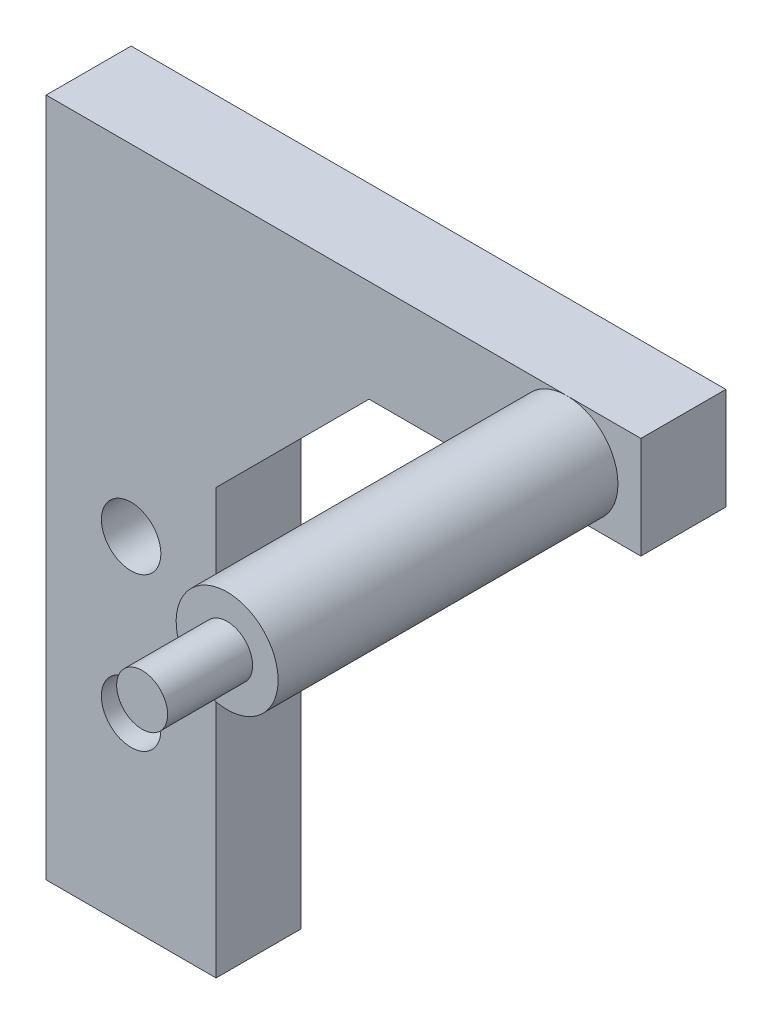
ISO-10303-21;
HEADER;
FILE_DESCRIPTION(('STEP AP214'),'2;1');
FILE_NAME('part.step','',(''),(''),'','','');
FILE_SCHEMA(('AUTOMOTIVE_DESIGN { 1 0 10303 214 1 1 1 1 }'));
ENDSEC;
DATA;
#1=APPLICATION_CONTEXT('core data for automotive mechanical design processes');
#2=APPLICATION_PROTOCOL_DEFINITION('international standard','automotive_design',2000,#1);
#3=PRODUCT_CONTEXT('',#1,'mechanical');
#4=PRODUCT('Part','Part','',(#3));
#5=PRODUCT_RELATED_PRODUCT_CATEGORY('part','',(#4));
#6=PRODUCT_DEFINITION_FORMATION('','',#4);
#7=PRODUCT_DEFINITION_CONTEXT('part definition',#1,'design');
#8=PRODUCT_DEFINITION('design','',#6,#7);
#9=PRODUCT_DEFINITION_SHAPE('','',#8);
#10=(LENGTH_UNIT() NAMED_UNIT(*) SI_UNIT(.MILLI.,.METRE.));
#11=(NAMED_UNIT(*) PLANE_ANGLE_UNIT() SI_UNIT($,.RADIAN.));
#12=(NAMED_UNIT(*) SI_UNIT($,.STERADIAN.) SOLID_ANGLE_UNIT());
#13=UNCERTAINTY_MEASURE_WITH_UNIT(LENGTH_MEASURE(1.E-05),#10,'distance_accuracy_value','');
#14=(GEOMETRIC_REPRESENTATION_CONTEXT(3) GLOBAL_UNCERTAINTY_ASSIGNED_CONTEXT((#13)) GLOBAL_UNIT_ASSIGNED_CONTEXT((#10,
#11,#12)) REPRESENTATION_CONTEXT('',''));
#15=CARTESIAN_POINT('',(0.,0.,0.));
#16=DIRECTION('',(0.,0.,1.));
#17=DIRECTION('',(1.,0.,0.));
#18=AXIS2_PLACEMENT_3D('',#15,#16,#17);
#19=CARTESIAN_POINT('',(0.,0.,5.));
#20=DIRECTION('',(0.,0.,-1.));
#21=DIRECTION('',(-1.,0.,0.));
#22=AXIS2_PLACEMENT_3D('',#19,#20,#21);
#23=PLANE('',#22);
#24=CARTESIAN_POINT('',(25.65,17.,5.));
#25=DIRECTION('',(0.,0.,1.));
#26=DIRECTION('',(1.,0.,0.));
#27=AXIS2_PLACEMENT_3D('',#24,#25,#26);
#28=CIRCLE('',#27,3.);
#29=CARTESIAN_POINT('',(25.65,20.,5.));
#30=VERTEX_POINT('',#29);
#31=CARTESIAN_POINT('',(25.65,14.,5.));
#32=VERTEX_POINT('',#31);
#33=EDGE_CURVE('E175',#30,#32,#28,.T.);
#34=ORIENTED_EDGE('',*,*,#33,.F.);
#35=DIRECTION('',(-1.,0.,0.));
#36=VECTOR('',#35,1.);
#37=CARTESIAN_POINT('',(-5.,20.,5.));
#38=LINE('',#37,#36);
#39=CARTESIAN_POINT('',(-5.,20.,5.));
#40=VERTEX_POINT('',#39);
#41=EDGE_CURVE('E247',#30,#40,#38,.T.);
#42=ORIENTED_EDGE('',*,*,#41,.T.);
#43=DIRECTION('',(0.,-1.,0.));
#44=VECTOR('',#43,1.);
#45=CARTESIAN_POINT('',(-5.,-20.,5.));
#46=LINE('',#45,#44);
#47=CARTESIAN_POINT('',(-5.,-20.,5.));
#48=VERTEX_POINT('',#47);
#49=EDGE_CURVE('E249',#40,#48,#46,.T.);
#50=ORIENTED_EDGE('',*,*,#49,.T.);
#51=DIRECTION('',(1.,0.,0.));
#52=VECTOR('',#51,1.);
#53=CARTESIAN_POINT('',(-5.,-20.,5.));
#54=LINE('',#53,#52);
#55=CARTESIAN_POINT('',(5.,-20.,5.));
#56=VERTEX_POINT('',#55);
#57=EDGE_CURVE('E156',#48,#56,#54,.T.);
#58=ORIENTED_EDGE('',*,*,#57,.T.);
#59=DIRECTION('',(0.,1.,0.));
#60=VECTOR('',#59,1.);
#61=CARTESIAN_POINT('',(5.,-20.,5.));
#62=LINE('',#61,#60);
#63=CARTESIAN_POINT('',(5.,5.,5.));
#64=VERTEX_POINT('',#63);
#65=EDGE_CURVE('E162',#56,#64,#62,.T.);
#66=ORIENTED_EDGE('',*,*,#65,.T.);
#67=DIRECTION('',(0.707106781186549,0.707106781186546,0.));
#68=VECTOR('',#67,1.);
#69=CARTESIAN_POINT('',(0.,0.,5.));
#70=LINE('',#69,#68);
#71=CARTESIAN_POINT('',(14.,14.,5.));
#72=VERTEX_POINT('',#71);
#73=EDGE_CURVE('E52',#64,#72,#70,.T.);
#74=ORIENTED_EDGE('',*,*,#73,.T.);
#75=DIRECTION('',(1.,0.,0.));
#76=VECTOR('',#75,1.);
#77=CARTESIAN_POINT('',(5.,14.,5.));
#78=LINE('',#77,#76);
#79=EDGE_CURVE('E57',#72,#32,#78,.T.);
#80=ORIENTED_EDGE('',*,*,#79,.T.);
#81=EDGE_LOOP('',(#34,#42,#50,#58,#66,#74,#80));
#82=FACE_BOUND('',#81,.T.);
#83=CARTESIAN_POINT('',(0.,0.,5.));
#84=DIRECTION('',(0.,0.,1.));
#85=DIRECTION('',(1.,0.,0.));
#86=AXIS2_PLACEMENT_3D('',#83,#84,#85);
#87=CIRCLE('',#86,1.75);
#88=CARTESIAN_POINT('',(1.75,0.,5.));
#89=VERTEX_POINT('',#88);
#90=EDGE_CURVE('E153',#89,#89,#87,.T.);
#91=ORIENTED_EDGE('',*,*,#90,.F.);
#92=EDGE_LOOP('',(#91));
#93=FACE_BOUND('',#92,.T.);
#94=CARTESIAN_POINT('',(0.,-9.,5.));
#95=DIRECTION('',(0.,0.,1.));
#96=DIRECTION('',(1.,0.,0.));
#97=AXIS2_PLACEMENT_3D('',#94,#95,#96);
#98=CIRCLE('',#97,1.75);
#99=CARTESIAN_POINT('',(1.75,-9.,5.));
#100=VERTEX_POINT('',#99);
#101=EDGE_CURVE('E232',#100,#100,#98,.T.);
#102=ORIENTED_EDGE('',*,*,#101,.F.);
#103=EDGE_LOOP('',(#102));
#104=FACE_BOUND('',#103,.T.);
#105=ADVANCED_FACE('F35',(#82,#93,#104),#23,.F.);
#106=CARTESIAN_POINT('',(5.,-20.,5.));
#107=DIRECTION('',(-1.,0.,0.));
#108=DIRECTION('',(0.,0.,1.));
#109=AXIS2_PLACEMENT_3D('',#106,#107,#108);
#110=PLANE('',#109);
#111=DIRECTION('',(0.,1.,0.));
#112=VECTOR('',#111,1.);
#113=CARTESIAN_POINT('',(5.,-20.,0.));
#114=LINE('',#113,#112);
#115=CARTESIAN_POINT('',(5.,-20.,0.));
#116=VERTEX_POINT('',#115);
#117=CARTESIAN_POINT('',(5.,5.,0.));
#118=VERTEX_POINT('',#117);
#119=EDGE_CURVE('E140',#116,#118,#114,.T.);
#120=ORIENTED_EDGE('',*,*,#119,.T.);
#121=DIRECTION('',(0.,0.,1.));
#122=VECTOR('',#121,1.);
#123=CARTESIAN_POINT('',(5.,5.,0.));
#124=LINE('',#123,#122);
#125=EDGE_CURVE('E125',#118,#64,#124,.T.);
#126=ORIENTED_EDGE('',*,*,#125,.T.);
#127=ORIENTED_EDGE('',*,*,#65,.F.);
#128=DIRECTION('',(0.,0.,-1.));
#129=VECTOR('',#128,1.);
#130=CARTESIAN_POINT('',(5.,-20.,5.));
#131=LINE('',#130,#129);
#132=EDGE_CURVE('E146',#56,#116,#131,.T.);
#133=ORIENTED_EDGE('',*,*,#132,.T.);
#134=EDGE_LOOP('',(#120,#126,#127,#133));
#135=FACE_BOUND('',#134,.T.);
#136=ADVANCED_FACE('F37',(#135),#110,.F.);
#137=CARTESIAN_POINT('',(-5.,20.,5.));
#138=DIRECTION('',(0.,-1.,0.));
#139=DIRECTION('',(0.,0.,-1.));
#140=AXIS2_PLACEMENT_3D('',#137,#138,#139);
#141=PLANE('',#140);
#142=DIRECTION('',(-1.,0.,0.));
#143=VECTOR('',#142,1.);
#144=CARTESIAN_POINT('',(-5.,20.,0.));
#145=LINE('',#144,#143);
#146=CARTESIAN_POINT('',(30.,20.,0.));
#147=VERTEX_POINT('',#146);
#148=CARTESIAN_POINT('',(-5.,20.,0.));
#149=VERTEX_POINT('',#148);
#150=EDGE_CURVE('E147',#147,#149,#145,.T.);
#151=ORIENTED_EDGE('',*,*,#150,.T.);
#152=DIRECTION('',(0.,0.,-1.));
#153=VECTOR('',#152,1.);
#154=CARTESIAN_POINT('',(-5.,20.,5.));
#155=LINE('',#154,#153);
#156=EDGE_CURVE('E39',#40,#149,#155,.T.);
#157=ORIENTED_EDGE('',*,*,#156,.F.);
#158=ORIENTED_EDGE('',*,*,#41,.F.);
#159=CARTESIAN_POINT('',(30.,20.,5.));
#160=VERTEX_POINT('',#159);
#161=EDGE_CURVE('E248',#160,#30,#38,.T.);
#162=ORIENTED_EDGE('',*,*,#161,.F.);
#163=DIRECTION('',(0.,0.,1.));
#164=VECTOR('',#163,1.);
#165=CARTESIAN_POINT('',(30.,20.,0.));
#166=LINE('',#165,#164);
#167=EDGE_CURVE('E201',#147,#160,#166,.T.);
#168=ORIENTED_EDGE('',*,*,#167,.F.);
#169=EDGE_LOOP('',(#151,#157,#158,#162,#168));
#170=FACE_BOUND('',#169,.T.);
#171=ADVANCED_FACE('F255',(#170),#141,.F.);
#172=CARTESIAN_POINT('',(-5.,-20.,5.));
#173=DIRECTION('',(1.,0.,0.));
#174=DIRECTION('',(0.,0.,-1.));
#175=AXIS2_PLACEMENT_3D('',#172,#173,#174);
#176=PLANE('',#175);
#177=DIRECTION('',(0.,-1.,0.));
#178=VECTOR('',#177,1.);
#179=CARTESIAN_POINT('',(-5.,-20.,0.));
#180=LINE('',#179,#178);
#181=CARTESIAN_POINT('',(-5.,-20.,0.));
#182=VERTEX_POINT('',#181);
#183=EDGE_CURVE('E150',#149,#182,#180,.T.);
#184=ORIENTED_EDGE('',*,*,#183,.T.);
#185=DIRECTION('',(0.,0.,-1.));
#186=VECTOR('',#185,1.);
#187=CARTESIAN_POINT('',(-5.,-20.,5.));
#188=LINE('',#187,#186);
#189=EDGE_CURVE('E163',#48,#182,#188,.T.);
#190=ORIENTED_EDGE('',*,*,#189,.F.);
#191=ORIENTED_EDGE('',*,*,#49,.F.);
#192=ORIENTED_EDGE('',*,*,#156,.T.);
#193=EDGE_LOOP('',(#184,#190,#191,#192));
#194=FACE_BOUND('',#193,.T.);
#195=ADVANCED_FACE('F253',(#194),#176,.F.);
#196=CARTESIAN_POINT('',(-5.,-20.,5.));
#197=DIRECTION('',(0.,1.,0.));
#198=DIRECTION('',(0.,0.,1.));
#199=AXIS2_PLACEMENT_3D('',#196,#197,#198);
#200=PLANE('',#199);
#201=DIRECTION('',(1.,0.,0.));
#202=VECTOR('',#201,1.);
#203=CARTESIAN_POINT('',(-5.,-20.,0.));
#204=LINE('',#203,#202);
#205=EDGE_CURVE('E160',#182,#116,#204,.T.);
#206=ORIENTED_EDGE('',*,*,#205,.T.);
#207=ORIENTED_EDGE('',*,*,#132,.F.);
#208=ORIENTED_EDGE('',*,*,#57,.F.);
#209=ORIENTED_EDGE('',*,*,#189,.T.);
#210=EDGE_LOOP('',(#206,#207,#208,#209));
#211=FACE_BOUND('',#210,.T.);
#212=ADVANCED_FACE('F251',(#211),#200,.F.);
#213=EDGE_CURVE('E44',#32,#30,#28,.T.);
#214=ORIENTED_EDGE('',*,*,#213,.F.);
#215=CARTESIAN_POINT('',(30.,14.,5.));
#216=VERTEX_POINT('',#215);
#217=EDGE_CURVE('E183',#32,#216,#78,.T.);
#218=ORIENTED_EDGE('',*,*,#217,.T.);
#219=DIRECTION('',(0.,1.,0.));
#220=VECTOR('',#219,1.);
#221=CARTESIAN_POINT('',(30.,20.,5.));
#222=LINE('',#221,#220);
#223=EDGE_CURVE('E194',#216,#160,#222,.T.);
#224=ORIENTED_EDGE('',*,*,#223,.T.);
#225=ORIENTED_EDGE('',*,*,#161,.T.);
#226=EDGE_LOOP('',(#214,#218,#224,#225));
#227=FACE_BOUND('',#226,.T.);
#228=ADVANCED_FACE('F261',(#227),#23,.F.);
#229=CARTESIAN_POINT('',(0.,0.,0.));
#230=DIRECTION('',(0.,0.,-1.));
#231=DIRECTION('',(-1.,0.,0.));
#232=AXIS2_PLACEMENT_3D('',#229,#230,#231);
#233=PLANE('',#232);
#234=DIRECTION('',(0.,-1.,0.));
#235=VECTOR('',#234,1.);
#236=CARTESIAN_POINT('',(2.5,17.5,0.));
#237=LINE('',#236,#235);
#238=CARTESIAN_POINT('',(2.5,17.5,0.));
#239=VERTEX_POINT('',#238);
#240=CARTESIAN_POINT('',(2.5,12.5,0.));
#241=VERTEX_POINT('',#240);
#242=EDGE_CURVE('E204',#239,#241,#237,.T.);
#243=ORIENTED_EDGE('',*,*,#242,.F.);
#244=DIRECTION('',(1.,0.,0.));
#245=VECTOR('',#244,1.);
#246=CARTESIAN_POINT('',(2.5,17.5,0.));
#247=LINE('',#246,#245);
#248=CARTESIAN_POINT('',(-2.5,17.5,0.));
#249=VERTEX_POINT('',#248);
#250=EDGE_CURVE('E211',#249,#239,#247,.T.);
#251=ORIENTED_EDGE('',*,*,#250,.F.);
#252=DIRECTION('',(0.,1.,0.));
#253=VECTOR('',#252,1.);
#254=CARTESIAN_POINT('',(-2.5,17.5,0.));
#255=LINE('',#254,#253);
#256=CARTESIAN_POINT('',(-2.5,12.5,0.));
#257=VERTEX_POINT('',#256);
#258=EDGE_CURVE('E225',#257,#249,#255,.T.);
#259=ORIENTED_EDGE('',*,*,#258,.F.);
#260=DIRECTION('',(-1.,0.,0.));
#261=VECTOR('',#260,1.);
#262=CARTESIAN_POINT('',(2.5,12.5,0.));
#263=LINE('',#262,#261);
#264=EDGE_CURVE('E222',#241,#257,#263,.T.);
#265=ORIENTED_EDGE('',*,*,#264,.F.);
#266=EDGE_LOOP('',(#243,#251,#259,#265));
#267=FACE_BOUND('',#266,.T.);
#268=CARTESIAN_POINT('',(0.,0.,0.));
#269=DIRECTION('',(0.,0.,1.));
#270=DIRECTION('',(1.,0.,0.));
#271=AXIS2_PLACEMENT_3D('',#268,#269,#270);
#272=CIRCLE('',#271,1.75);
#273=CARTESIAN_POINT('',(1.75,0.,0.));
#274=VERTEX_POINT('',#273);
#275=EDGE_CURVE('E148',#274,#274,#272,.T.);
#276=ORIENTED_EDGE('',*,*,#275,.T.);
#277=EDGE_LOOP('',(#276));
#278=FACE_BOUND('',#277,.T.);
#279=CARTESIAN_POINT('',(0.,-9.,0.));
#280=DIRECTION('',(0.,0.,1.));
#281=DIRECTION('',(1.,0.,0.));
#282=AXIS2_PLACEMENT_3D('',#279,#280,#281);
#283=CIRCLE('',#282,1.75);
#284=CARTESIAN_POINT('',(1.75,-9.,0.));
#285=VERTEX_POINT('',#284);
#286=EDGE_CURVE('E241',#285,#285,#283,.T.);
#287=ORIENTED_EDGE('',*,*,#286,.T.);
#288=EDGE_LOOP('',(#287));
#289=FACE_BOUND('',#288,.T.);
#290=ORIENTED_EDGE('',*,*,#119,.F.);
#291=ORIENTED_EDGE('',*,*,#205,.F.);
#292=ORIENTED_EDGE('',*,*,#183,.F.);
#293=ORIENTED_EDGE('',*,*,#150,.F.);
#294=DIRECTION('',(0.,1.,0.));
#295=VECTOR('',#294,1.);
#296=CARTESIAN_POINT('',(30.,20.,0.));
#297=LINE('',#296,#295);
#298=CARTESIAN_POINT('',(30.,14.,0.));
#299=VERTEX_POINT('',#298);
#300=EDGE_CURVE('E199',#299,#147,#297,.T.);
#301=ORIENTED_EDGE('',*,*,#300,.F.);
#302=DIRECTION('',(1.,0.,0.));
#303=VECTOR('',#302,1.);
#304=CARTESIAN_POINT('',(5.,14.,0.));
#305=LINE('',#304,#303);
#306=CARTESIAN_POINT('',(14.,14.,0.));
#307=VERTEX_POINT('',#306);
#308=EDGE_CURVE('E142',#307,#299,#305,.T.);
#309=ORIENTED_EDGE('',*,*,#308,.F.);
#310=DIRECTION('',(0.707106781186549,0.707106781186546,0.));
#311=VECTOR('',#310,1.);
#312=CARTESIAN_POINT('',(0.,0.,0.));
#313=LINE('',#312,#311);
#314=EDGE_CURVE('E128',#118,#307,#313,.T.);
#315=ORIENTED_EDGE('',*,*,#314,.F.);
#316=EDGE_LOOP('',(#290,#291,#292,#293,#301,#309,#315));
#317=FACE_BOUND('',#316,.T.);
#318=ADVANCED_FACE('F138',(#267,#278,#289,#317),#233,.T.);
#319=CARTESIAN_POINT('',(0.,-9.,0.));
#320=DIRECTION('',(0.,0.,1.));
#321=DIRECTION('',(1.,0.,0.));
#322=AXIS2_PLACEMENT_3D('',#319,#320,#321);
#323=CYLINDRICAL_SURFACE('',#322,1.75);
#324=ORIENTED_EDGE('',*,*,#286,.F.);
#325=EDGE_LOOP('',(#324));
#326=FACE_BOUND('',#325,.T.);
#327=ORIENTED_EDGE('',*,*,#101,.T.);
#328=EDGE_LOOP('',(#327));
#329=FACE_BOUND('',#328,.T.);
#330=ADVANCED_FACE('F276',(#326,#329),#323,.F.);
#331=CARTESIAN_POINT('',(0.,0.,0.));
#332=DIRECTION('',(0.,0.,1.));
#333=DIRECTION('',(1.,0.,0.));
#334=AXIS2_PLACEMENT_3D('',#331,#332,#333);
#335=CYLINDRICAL_SURFACE('',#334,1.75);
#336=ORIENTED_EDGE('',*,*,#275,.F.);
#337=EDGE_LOOP('',(#336));
#338=FACE_BOUND('',#337,.T.);
#339=ORIENTED_EDGE('',*,*,#90,.T.);
#340=EDGE_LOOP('',(#339));
#341=FACE_BOUND('',#340,.T.);
#342=ADVANCED_FACE('F313',(#338,#341),#335,.F.);
#343=CARTESIAN_POINT('',(2.5,17.5,2.));
#344=DIRECTION('',(1.,0.,0.));
#345=DIRECTION('',(0.,1.,0.));
#346=AXIS2_PLACEMENT_3D('',#343,#344,#345);
#347=PLANE('',#346);
#348=ORIENTED_EDGE('',*,*,#242,.T.);
#349=DIRECTION('',(0.,0.,-1.));
#350=VECTOR('',#349,1.);
#351=CARTESIAN_POINT('',(2.5,12.5,2.));
#352=LINE('',#351,#350);
#353=CARTESIAN_POINT('',(2.5,12.5,2.));
#354=VERTEX_POINT('',#353);
#355=EDGE_CURVE('E220',#354,#241,#352,.T.);
#356=ORIENTED_EDGE('',*,*,#355,.F.);
#357=DIRECTION('',(0.,-1.,0.));
#358=VECTOR('',#357,1.);
#359=CARTESIAN_POINT('',(2.5,17.5,2.));
#360=LINE('',#359,#358);
#361=CARTESIAN_POINT('',(2.5,17.5,2.));
#362=VERTEX_POINT('',#361);
#363=EDGE_CURVE('E207',#362,#354,#360,.T.);
#364=ORIENTED_EDGE('',*,*,#363,.F.);
#365=DIRECTION('',(0.,0.,-1.));
#366=VECTOR('',#365,1.);
#367=CARTESIAN_POINT('',(2.5,17.5,2.));
#368=LINE('',#367,#366);
#369=EDGE_CURVE('E230',#362,#239,#368,.T.);
#370=ORIENTED_EDGE('',*,*,#369,.T.);
#371=EDGE_LOOP('',(#348,#356,#364,#370));
#372=FACE_BOUND('',#371,.T.);
#373=ADVANCED_FACE('F303',(#372),#347,.F.);
#374=CARTESIAN_POINT('',(2.5,17.5,2.));
#375=DIRECTION('',(0.,1.,0.));
#376=DIRECTION('',(0.,0.,1.));
#377=AXIS2_PLACEMENT_3D('',#374,#375,#376);
#378=PLANE('',#377);
#379=ORIENTED_EDGE('',*,*,#250,.T.);
#380=ORIENTED_EDGE('',*,*,#369,.F.);
#381=DIRECTION('',(1.,0.,0.));
#382=VECTOR('',#381,1.);
#383=CARTESIAN_POINT('',(2.5,17.5,2.));
#384=LINE('',#383,#382);
#385=CARTESIAN_POINT('',(-2.5,17.5,2.));
#386=VERTEX_POINT('',#385);
#387=EDGE_CURVE('E217',#386,#362,#384,.T.);
#388=ORIENTED_EDGE('',*,*,#387,.F.);
#389=DIRECTION('',(0.,0.,-1.));
#390=VECTOR('',#389,1.);
#391=CARTESIAN_POINT('',(-2.5,17.5,2.));
#392=LINE('',#391,#390);
#393=EDGE_CURVE('E233',#386,#249,#392,.T.);
#394=ORIENTED_EDGE('',*,*,#393,.T.);
#395=EDGE_LOOP('',(#379,#380,#388,#394));
#396=FACE_BOUND('',#395,.T.);
#397=ADVANCED_FACE('F299',(#396),#378,.F.);
#398=CARTESIAN_POINT('',(-2.5,17.5,2.));
#399=DIRECTION('',(-1.,0.,0.));
#400=DIRECTION('',(0.,-1.,0.));
#401=AXIS2_PLACEMENT_3D('',#398,#399,#400);
#402=PLANE('',#401);
#403=ORIENTED_EDGE('',*,*,#258,.T.);
#404=ORIENTED_EDGE('',*,*,#393,.F.);
#405=DIRECTION('',(0.,1.,0.));
#406=VECTOR('',#405,1.);
#407=CARTESIAN_POINT('',(-2.5,17.5,2.));
#408=LINE('',#407,#406);
#409=CARTESIAN_POINT('',(-2.5,12.5,2.));
#410=VERTEX_POINT('',#409);
#411=EDGE_CURVE('E214',#410,#386,#408,.T.);
#412=ORIENTED_EDGE('',*,*,#411,.F.);
#413=DIRECTION('',(0.,0.,-1.));
#414=VECTOR('',#413,1.);
#415=CARTESIAN_POINT('',(-2.5,12.5,2.));
#416=LINE('',#415,#414);
#417=EDGE_CURVE('E235',#410,#257,#416,.T.);
#418=ORIENTED_EDGE('',*,*,#417,.T.);
#419=EDGE_LOOP('',(#403,#404,#412,#418));
#420=FACE_BOUND('',#419,.T.);
#421=ADVANCED_FACE('F302',(#420),#402,.F.);
#422=CARTESIAN_POINT('',(2.5,12.5,2.));
#423=DIRECTION('',(0.,-1.,0.));
#424=DIRECTION('',(0.,0.,-1.));
#425=AXIS2_PLACEMENT_3D('',#422,#423,#424);
#426=PLANE('',#425);
#427=ORIENTED_EDGE('',*,*,#264,.T.);
#428=ORIENTED_EDGE('',*,*,#417,.F.);
#429=DIRECTION('',(-1.,0.,0.));
#430=VECTOR('',#429,1.);
#431=CARTESIAN_POINT('',(2.5,12.5,2.));
#432=LINE('',#431,#430);
#433=EDGE_CURVE('E210',#354,#410,#432,.T.);
#434=ORIENTED_EDGE('',*,*,#433,.F.);
#435=ORIENTED_EDGE('',*,*,#355,.T.);
#436=EDGE_LOOP('',(#427,#428,#434,#435));
#437=FACE_BOUND('',#436,.T.);
#438=ADVANCED_FACE('F293',(#437),#426,.F.);
#439=CARTESIAN_POINT('',(0.,0.,2.));
#440=DIRECTION('',(0.,0.,-1.));
#441=DIRECTION('',(-1.,0.,0.));
#442=AXIS2_PLACEMENT_3D('',#439,#440,#441);
#443=PLANE('',#442);
#444=ORIENTED_EDGE('',*,*,#363,.T.);
#445=ORIENTED_EDGE('',*,*,#433,.T.);
#446=ORIENTED_EDGE('',*,*,#411,.T.);
#447=ORIENTED_EDGE('',*,*,#387,.T.);
#448=EDGE_LOOP('',(#444,#445,#446,#447));
#449=FACE_BOUND('',#448,.T.);
#450=ADVANCED_FACE('F285',(#449),#443,.T.);
#451=CARTESIAN_POINT('',(30.,20.,0.));
#452=DIRECTION('',(1.,0.,0.));
#453=DIRECTION('',(0.,0.,-1.));
#454=AXIS2_PLACEMENT_3D('',#451,#452,#453);
#455=PLANE('',#454);
#456=ORIENTED_EDGE('',*,*,#223,.F.);
#457=DIRECTION('',(0.,0.,1.));
#458=VECTOR('',#457,1.);
#459=CARTESIAN_POINT('',(30.,14.,0.));
#460=LINE('',#459,#458);
#461=EDGE_CURVE('E205',#299,#216,#460,.T.);
#462=ORIENTED_EDGE('',*,*,#461,.F.);
#463=ORIENTED_EDGE('',*,*,#300,.T.);
#464=ORIENTED_EDGE('',*,*,#167,.T.);
#465=EDGE_LOOP('',(#456,#462,#463,#464));
#466=FACE_BOUND('',#465,.T.);
#467=ADVANCED_FACE('F283',(#466),#455,.T.);
#468=CARTESIAN_POINT('',(5.,14.,0.));
#469=DIRECTION('',(0.,-1.,0.));
#470=DIRECTION('',(0.,0.,-1.));
#471=AXIS2_PLACEMENT_3D('',#468,#469,#470);
#472=PLANE('',#471);
#473=DIRECTION('',(0.,0.,1.));
#474=VECTOR('',#473,1.);
#475=CARTESIAN_POINT('',(14.,14.,0.));
#476=LINE('',#475,#474);
#477=EDGE_CURVE('E133',#307,#72,#476,.T.);
#478=ORIENTED_EDGE('',*,*,#477,.F.);
#479=ORIENTED_EDGE('',*,*,#308,.T.);
#480=ORIENTED_EDGE('',*,*,#461,.T.);
#481=ORIENTED_EDGE('',*,*,#217,.F.);
#482=ORIENTED_EDGE('',*,*,#79,.F.);
#483=EDGE_LOOP('',(#478,#479,#480,#481,#482));
#484=FACE_BOUND('',#483,.T.);
#485=ADVANCED_FACE('F192',(#484),#472,.T.);
#486=CARTESIAN_POINT('',(25.65,17.,25.));
#487=DIRECTION('',(0.,0.,-1.));
#488=DIRECTION('',(-1.,0.,0.));
#489=AXIS2_PLACEMENT_3D('',#486,#487,#488);
#490=CYLINDRICAL_SURFACE('',#489,3.);
#491=CARTESIAN_POINT('',(25.65,17.,25.));
#492=DIRECTION('',(0.,0.,1.));
#493=DIRECTION('',(1.,0.,0.));
#494=AXIS2_PLACEMENT_3D('',#491,#492,#493);
#495=CIRCLE('',#494,3.);
#496=CARTESIAN_POINT('',(28.65,17.,25.));
#497=VERTEX_POINT('',#496);
#498=EDGE_CURVE('E180',#497,#497,#495,.T.);
#499=ORIENTED_EDGE('',*,*,#498,.F.);
#500=EDGE_LOOP('',(#499));
#501=FACE_BOUND('',#500,.T.);
#502=ORIENTED_EDGE('',*,*,#33,.T.);
#503=ORIENTED_EDGE('',*,*,#213,.T.);
#504=EDGE_LOOP('',(#502,#503));
#505=FACE_BOUND('',#504,.T.);
#506=ADVANCED_FACE('F291',(#501,#505),#490,.T.);
#507=CARTESIAN_POINT('',(25.65,17.,25.));
#508=DIRECTION('',(0.,0.,1.));
#509=DIRECTION('',(1.,0.,0.));
#510=AXIS2_PLACEMENT_3D('',#507,#508,#509);
#511=PLANE('',#510);
#512=CARTESIAN_POINT('',(25.65,17.,25.));
#513=DIRECTION('',(0.,0.,1.));
#514=DIRECTION('',(1.,0.,0.));
#515=AXIS2_PLACEMENT_3D('',#512,#513,#514);
#516=CIRCLE('',#515,1.5);
#517=CARTESIAN_POINT('',(27.15,17.,25.));
#518=VERTEX_POINT('',#517);
#519=EDGE_CURVE('E11',#518,#518,#516,.T.);
#520=ORIENTED_EDGE('',*,*,#519,.F.);
#521=EDGE_LOOP('',(#520));
#522=FACE_BOUND('',#521,.T.);
#523=ORIENTED_EDGE('',*,*,#498,.T.);
#524=EDGE_LOOP('',(#523));
#525=FACE_BOUND('',#524,.T.);
#526=ADVANCED_FACE('F380',(#522,#525),#511,.T.);
#527=CARTESIAN_POINT('',(25.65,17.,30.));
#528=DIRECTION('',(0.,0.,-1.));
#529=DIRECTION('',(-1.,0.,0.));
#530=AXIS2_PLACEMENT_3D('',#527,#528,#529);
#531=CYLINDRICAL_SURFACE('',#530,1.5);
#532=CARTESIAN_POINT('',(25.65,17.,30.));
#533=DIRECTION('',(0.,0.,1.));
#534=DIRECTION('',(1.,0.,0.));
#535=AXIS2_PLACEMENT_3D('',#532,#533,#534);
#536=CIRCLE('',#535,1.5);
#537=CARTESIAN_POINT('',(27.15,17.,30.));
#538=VERTEX_POINT('',#537);
#539=EDGE_CURVE('E181',#538,#538,#536,.T.);
#540=ORIENTED_EDGE('',*,*,#539,.F.);
#541=EDGE_LOOP('',(#540));
#542=FACE_BOUND('',#541,.T.);
#543=ORIENTED_EDGE('',*,*,#519,.T.);
#544=EDGE_LOOP('',(#543));
#545=FACE_BOUND('',#544,.T.);
#546=ADVANCED_FACE('F390',(#542,#545),#531,.T.);
#547=CARTESIAN_POINT('',(25.65,17.,30.));
#548=DIRECTION('',(0.,0.,1.));
#549=DIRECTION('',(1.,0.,0.));
#550=AXIS2_PLACEMENT_3D('',#547,#548,#549);
#551=PLANE('',#550);
#552=ORIENTED_EDGE('',*,*,#539,.T.);
#553=EDGE_LOOP('',(#552));
#554=FACE_BOUND('',#553,.T.);
#555=ADVANCED_FACE('F399',(#554),#551,.T.);
#556=CARTESIAN_POINT('',(0.,0.,0.));
#557=DIRECTION('',(0.707106781186546,-0.707106781186549,0.));
#558=DIRECTION('',(0.707106781186549,0.707106781186546,0.));
#559=AXIS2_PLACEMENT_3D('',#556,#557,#558);
#560=PLANE('',#559);
#561=ORIENTED_EDGE('',*,*,#73,.F.);
#562=ORIENTED_EDGE('',*,*,#125,.F.);
#563=ORIENTED_EDGE('',*,*,#314,.T.);
#564=ORIENTED_EDGE('',*,*,#477,.T.);
#565=EDGE_LOOP('',(#561,#562,#563,#564));
#566=FACE_BOUND('',#565,.T.);
#567=ADVANCED_FACE('F127',(#566),#560,.T.);
#568=CLOSED_SHELL('',(#105,#136,#171,#195,#212,#228,#318,#330,#342,#373,#397,#421,#438,#450,
#467,#485,#506,#526,#546,#555,#567));
#569=MANIFOLD_SOLID_BREP('B2',#568);
#570=ADVANCED_BREP_SHAPE_REPRESENTATION('',(#18,#569),#14);
#571=SHAPE_DEFINITION_REPRESENTATION(#9,#570);
ENDSEC;
END-ISO-10303-21;
